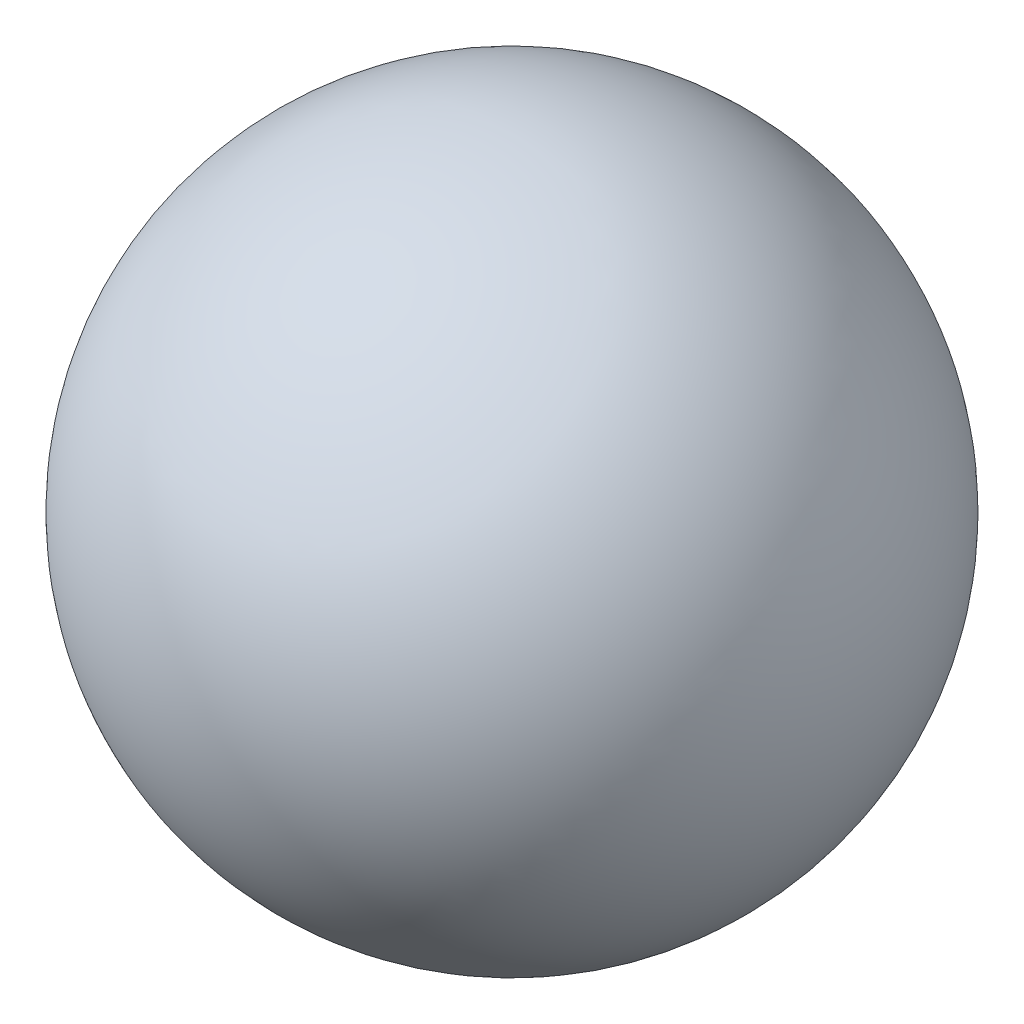
ISO-10303-21;
HEADER;
FILE_DESCRIPTION(('STEP AP214'),'2;1');
FILE_NAME('part.step','',(''),(''),'','','');
FILE_SCHEMA(('AUTOMOTIVE_DESIGN { 1 0 10303 214 1 1 1 1 }'));
ENDSEC;
DATA;
#1=APPLICATION_CONTEXT('core data for automotive mechanical design processes');
#2=APPLICATION_PROTOCOL_DEFINITION('international standard','automotive_design',2000,#1);
#3=PRODUCT_CONTEXT('',#1,'mechanical');
#4=PRODUCT('Part','Part','',(#3));
#5=PRODUCT_RELATED_PRODUCT_CATEGORY('part','',(#4));
#6=PRODUCT_DEFINITION_FORMATION('','',#4);
#7=PRODUCT_DEFINITION_CONTEXT('part definition',#1,'design');
#8=PRODUCT_DEFINITION('design','',#6,#7);
#9=PRODUCT_DEFINITION_SHAPE('','',#8);
#10=(LENGTH_UNIT() NAMED_UNIT(*) SI_UNIT(.MILLI.,.METRE.));
#11=(NAMED_UNIT(*) PLANE_ANGLE_UNIT() SI_UNIT($,.RADIAN.));
#12=(NAMED_UNIT(*) SI_UNIT($,.STERADIAN.) SOLID_ANGLE_UNIT());
#13=UNCERTAINTY_MEASURE_WITH_UNIT(LENGTH_MEASURE(1.E-05),#10,'distance_accuracy_value','');
#14=(GEOMETRIC_REPRESENTATION_CONTEXT(3) GLOBAL_UNCERTAINTY_ASSIGNED_CONTEXT((#13)) GLOBAL_UNIT_ASSIGNED_CONTEXT((#10,
#11,#12)) REPRESENTATION_CONTEXT('',''));
#15=CARTESIAN_POINT('',(0.,0.,0.));
#16=DIRECTION('',(0.,0.,1.));
#17=DIRECTION('',(1.,0.,0.));
#18=AXIS2_PLACEMENT_3D('',#15,#16,#17);
#19=CARTESIAN_POINT('',(0.,0.,-4.));
#20=DIRECTION('',(0.,0.,-1.));
#21=DIRECTION('',(-1.,0.,0.));
#22=AXIS2_PLACEMENT_3D('',#19,#20,#21);
#23=SPHERICAL_SURFACE('',#22,4.);
#24=CARTESIAN_POINT('',(0.,0.,-7.5));
#25=DIRECTION('',(0.,0.,-1.));
#26=DIRECTION('',(-1.,0.,0.));
#27=AXIS2_PLACEMENT_3D('',#24,#25,#26);
#28=CIRCLE('',#27,1.93649167310371);
#29=CARTESIAN_POINT('',(-1.93649167310371,0.,-7.5));
#30=VERTEX_POINT('',#29);
#31=EDGE_CURVE('E12',#30,#30,#28,.T.);
#32=ORIENTED_EDGE('',*,*,#31,.F.);
#33=EDGE_LOOP('',(#32));
#34=FACE_BOUND('',#33,.T.);
#35=ADVANCED_FACE('F42',(#34),#23,.T.);
#36=CARTESIAN_POINT('',(1.93649167310371,0.,-7.5));
#37=DIRECTION('',(0.,0.,1.));
#38=DIRECTION('',(1.,0.,0.));
#39=AXIS2_PLACEMENT_3D('',#36,#37,#38);
#40=PLANE('',#39);
#41=CARTESIAN_POINT('',(0.,0.,-7.5));
#42=DIRECTION('',(0.,0.,-1.));
#43=DIRECTION('',(-1.,0.,0.));
#44=AXIS2_PLACEMENT_3D('',#41,#42,#43);
#45=CIRCLE('',#44,1.24999999999999);
#46=CARTESIAN_POINT('',(-1.24999999999999,0.,-7.5));
#47=VERTEX_POINT('',#46);
#48=EDGE_CURVE('E60',#47,#47,#45,.T.);
#49=ORIENTED_EDGE('',*,*,#48,.F.);
#50=EDGE_LOOP('',(#49));
#51=FACE_BOUND('',#50,.T.);
#52=ORIENTED_EDGE('',*,*,#31,.T.);
#53=EDGE_LOOP('',(#52));
#54=FACE_BOUND('',#53,.T.);
#55=ADVANCED_FACE('F55',(#51,#54),#40,.F.);
#56=CARTESIAN_POINT('',(0.,0.,-2.5));
#57=DIRECTION('',(0.,0.,-1.));
#58=DIRECTION('',(-1.,0.,0.));
#59=AXIS2_PLACEMENT_3D('',#56,#57,#58);
#60=CONICAL_SURFACE('',#59,1.24999999999999,1.02974425867665);
#61=CARTESIAN_POINT('',(0.,0.,-1.74892422621555));
#62=VERTEX_POINT('',#61);
#63=VERTEX_LOOP('',#62);
#64=FACE_BOUND('',#63,.T.);
#65=CARTESIAN_POINT('',(0.,0.,-2.5));
#66=DIRECTION('',(0.,0.,-1.));
#67=DIRECTION('',(-1.,0.,0.));
#68=AXIS2_PLACEMENT_3D('',#65,#66,#67);
#69=CIRCLE('',#68,1.24999999999999);
#70=CARTESIAN_POINT('',(-1.24999999999999,0.,-2.5));
#71=VERTEX_POINT('',#70);
#72=EDGE_CURVE('E48',#71,#71,#69,.T.);
#73=ORIENTED_EDGE('',*,*,#72,.T.);
#74=EDGE_LOOP('',(#73));
#75=FACE_BOUND('',#74,.T.);
#76=ADVANCED_FACE('F51',(#64,#75),#60,.F.);
#77=CARTESIAN_POINT('',(0.,0.,-7.5));
#78=DIRECTION('',(0.,0.,-1.));
#79=DIRECTION('',(-1.,0.,0.));
#80=AXIS2_PLACEMENT_3D('',#77,#78,#79);
#81=CYLINDRICAL_SURFACE('',#80,1.24999999999999);
#82=ORIENTED_EDGE('',*,*,#72,.F.);
#83=EDGE_LOOP('',(#82));
#84=FACE_BOUND('',#83,.T.);
#85=ORIENTED_EDGE('',*,*,#48,.T.);
#86=EDGE_LOOP('',(#85));
#87=FACE_BOUND('',#86,.T.);
#88=ADVANCED_FACE('F54',(#84,#87),#81,.F.);
#89=CLOSED_SHELL('',(#35,#55,#76,#88));
#90=MANIFOLD_SOLID_BREP('B2',#89);
#91=ADVANCED_BREP_SHAPE_REPRESENTATION('',(#18,#90),#14);
#92=SHAPE_DEFINITION_REPRESENTATION(#9,#91);
ENDSEC;
END-ISO-10303-21;
